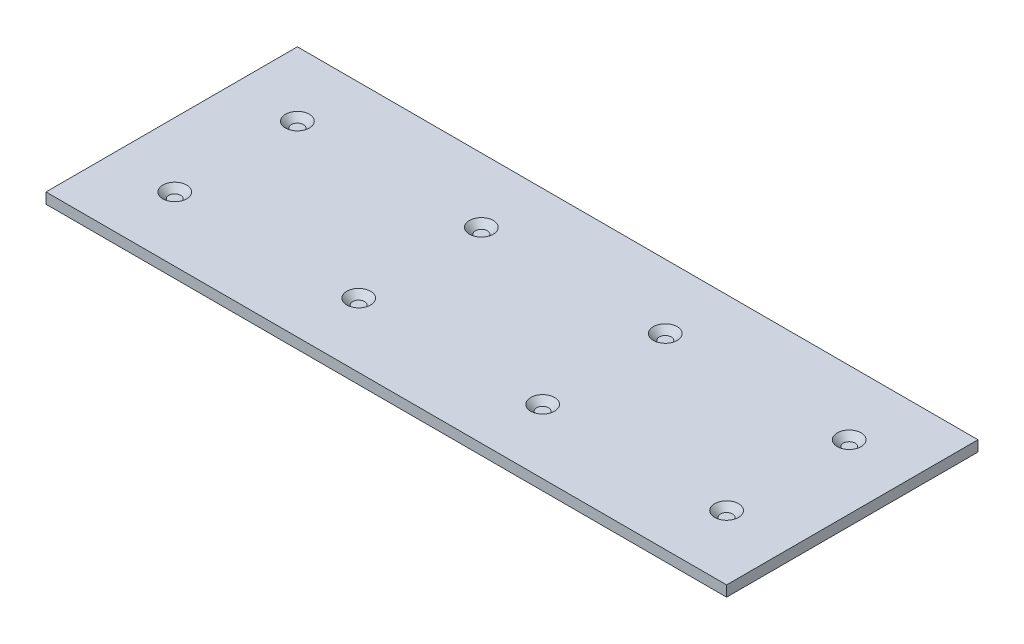
ISO-10303-21;
HEADER;
FILE_DESCRIPTION(('STEP AP214'),'2;1');
FILE_NAME('part.step','',(''),(''),'','','');
FILE_SCHEMA(('AUTOMOTIVE_DESIGN { 1 0 10303 214 1 1 1 1 }'));
ENDSEC;
DATA;
#1=APPLICATION_CONTEXT('core data for automotive mechanical design processes');
#2=APPLICATION_PROTOCOL_DEFINITION('international standard','automotive_design',2000,#1);
#3=PRODUCT_CONTEXT('',#1,'mechanical');
#4=PRODUCT('Part','Part','',(#3));
#5=PRODUCT_RELATED_PRODUCT_CATEGORY('part','',(#4));
#6=PRODUCT_DEFINITION_FORMATION('','',#4);
#7=PRODUCT_DEFINITION_CONTEXT('part definition',#1,'design');
#8=PRODUCT_DEFINITION('design','',#6,#7);
#9=PRODUCT_DEFINITION_SHAPE('','',#8);
#10=(LENGTH_UNIT() NAMED_UNIT(*) SI_UNIT(.MILLI.,.METRE.));
#11=(NAMED_UNIT(*) PLANE_ANGLE_UNIT() SI_UNIT($,.RADIAN.));
#12=(NAMED_UNIT(*) SI_UNIT($,.STERADIAN.) SOLID_ANGLE_UNIT());
#13=UNCERTAINTY_MEASURE_WITH_UNIT(LENGTH_MEASURE(1.E-05),#10,'distance_accuracy_value','');
#14=(GEOMETRIC_REPRESENTATION_CONTEXT(3) GLOBAL_UNCERTAINTY_ASSIGNED_CONTEXT((#13)) GLOBAL_UNIT_ASSIGNED_CONTEXT((#10,
#11,#12)) REPRESENTATION_CONTEXT('',''));
#15=CARTESIAN_POINT('',(0.,0.,0.));
#16=DIRECTION('',(0.,0.,1.));
#17=DIRECTION('',(1.,0.,0.));
#18=AXIS2_PLACEMENT_3D('',#15,#16,#17);
#19=CARTESIAN_POINT('',(0.,4.,0.));
#20=DIRECTION('',(1.,0.,0.));
#21=DIRECTION('',(0.,0.,-1.));
#22=AXIS2_PLACEMENT_3D('',#19,#20,#21);
#23=PLANE('',#22);
#24=DIRECTION('',(0.,0.,1.));
#25=VECTOR('',#24,1.);
#26=CARTESIAN_POINT('',(0.,0.,0.));
#27=LINE('',#26,#25);
#28=CARTESIAN_POINT('',(0.,0.,-94.3));
#29=VERTEX_POINT('',#28);
#30=CARTESIAN_POINT('',(0.,0.,0.));
#31=VERTEX_POINT('',#30);
#32=EDGE_CURVE('E100',#29,#31,#27,.T.);
#33=ORIENTED_EDGE('',*,*,#32,.T.);
#34=DIRECTION('',(0.,-1.,0.));
#35=VECTOR('',#34,1.);
#36=CARTESIAN_POINT('',(0.,4.,0.));
#37=LINE('',#36,#35);
#38=CARTESIAN_POINT('',(0.,4.,0.));
#39=VERTEX_POINT('',#38);
#40=EDGE_CURVE('E11',#39,#31,#37,.T.);
#41=ORIENTED_EDGE('',*,*,#40,.F.);
#42=DIRECTION('',(0.,0.,1.));
#43=VECTOR('',#42,1.);
#44=CARTESIAN_POINT('',(0.,4.,0.));
#45=LINE('',#44,#43);
#46=CARTESIAN_POINT('',(0.,4.,-94.3));
#47=VERTEX_POINT('',#46);
#48=EDGE_CURVE('E88',#47,#39,#45,.T.);
#49=ORIENTED_EDGE('',*,*,#48,.F.);
#50=DIRECTION('',(0.,-1.,0.));
#51=VECTOR('',#50,1.);
#52=CARTESIAN_POINT('',(0.,4.,-94.3));
#53=LINE('',#52,#51);
#54=EDGE_CURVE('E96',#47,#29,#53,.T.);
#55=ORIENTED_EDGE('',*,*,#54,.T.);
#56=EDGE_LOOP('',(#33,#41,#49,#55));
#57=FACE_BOUND('',#56,.T.);
#58=ADVANCED_FACE('F37',(#57),#23,.F.);
#59=CARTESIAN_POINT('',(0.,4.,0.));
#60=DIRECTION('',(0.,0.,-1.));
#61=DIRECTION('',(-1.,0.,0.));
#62=AXIS2_PLACEMENT_3D('',#59,#60,#61);
#63=PLANE('',#62);
#64=DIRECTION('',(1.,0.,0.));
#65=VECTOR('',#64,1.);
#66=CARTESIAN_POINT('',(0.,0.,0.));
#67=LINE('',#66,#65);
#68=CARTESIAN_POINT('',(255.3,0.,0.));
#69=VERTEX_POINT('',#68);
#70=EDGE_CURVE('E92',#31,#69,#67,.T.);
#71=ORIENTED_EDGE('',*,*,#70,.T.);
#72=DIRECTION('',(0.,-1.,0.));
#73=VECTOR('',#72,1.);
#74=CARTESIAN_POINT('',(255.3,4.,0.));
#75=LINE('',#74,#73);
#76=CARTESIAN_POINT('',(255.3,4.,0.));
#77=VERTEX_POINT('',#76);
#78=EDGE_CURVE('E45',#77,#69,#75,.T.);
#79=ORIENTED_EDGE('',*,*,#78,.F.);
#80=DIRECTION('',(1.,0.,0.));
#81=VECTOR('',#80,1.);
#82=CARTESIAN_POINT('',(0.,4.,0.));
#83=LINE('',#82,#81);
#84=EDGE_CURVE('E83',#39,#77,#83,.T.);
#85=ORIENTED_EDGE('',*,*,#84,.F.);
#86=ORIENTED_EDGE('',*,*,#40,.T.);
#87=EDGE_LOOP('',(#71,#79,#85,#86));
#88=FACE_BOUND('',#87,.T.);
#89=ADVANCED_FACE('F91',(#88),#63,.F.);
#90=CARTESIAN_POINT('',(255.3,4.,0.));
#91=DIRECTION('',(-1.,0.,0.));
#92=DIRECTION('',(0.,0.,1.));
#93=AXIS2_PLACEMENT_3D('',#90,#91,#92);
#94=PLANE('',#93);
#95=DIRECTION('',(0.,0.,-1.));
#96=VECTOR('',#95,1.);
#97=CARTESIAN_POINT('',(255.3,0.,0.));
#98=LINE('',#97,#96);
#99=CARTESIAN_POINT('',(255.3,0.,-94.3));
#100=VERTEX_POINT('',#99);
#101=EDGE_CURVE('E70',#69,#100,#98,.T.);
#102=ORIENTED_EDGE('',*,*,#101,.T.);
#103=DIRECTION('',(0.,-1.,0.));
#104=VECTOR('',#103,1.);
#105=CARTESIAN_POINT('',(255.3,4.,-94.3));
#106=LINE('',#105,#104);
#107=CARTESIAN_POINT('',(255.3,4.,-94.3));
#108=VERTEX_POINT('',#107);
#109=EDGE_CURVE('E93',#108,#100,#106,.T.);
#110=ORIENTED_EDGE('',*,*,#109,.F.);
#111=DIRECTION('',(0.,0.,-1.));
#112=VECTOR('',#111,1.);
#113=CARTESIAN_POINT('',(255.3,4.,0.));
#114=LINE('',#113,#112);
#115=EDGE_CURVE('E86',#77,#108,#114,.T.);
#116=ORIENTED_EDGE('',*,*,#115,.F.);
#117=ORIENTED_EDGE('',*,*,#78,.T.);
#118=EDGE_LOOP('',(#102,#110,#116,#117));
#119=FACE_BOUND('',#118,.T.);
#120=ADVANCED_FACE('F94',(#119),#94,.F.);
#121=CARTESIAN_POINT('',(0.,4.,-94.3));
#122=DIRECTION('',(0.,0.,1.));
#123=DIRECTION('',(1.,0.,0.));
#124=AXIS2_PLACEMENT_3D('',#121,#122,#123);
#125=PLANE('',#124);
#126=DIRECTION('',(-1.,0.,0.));
#127=VECTOR('',#126,1.);
#128=CARTESIAN_POINT('',(0.,0.,-94.3));
#129=LINE('',#128,#127);
#130=EDGE_CURVE('E76',#100,#29,#129,.T.);
#131=ORIENTED_EDGE('',*,*,#130,.T.);
#132=ORIENTED_EDGE('',*,*,#54,.F.);
#133=DIRECTION('',(-1.,0.,0.));
#134=VECTOR('',#133,1.);
#135=CARTESIAN_POINT('',(0.,4.,-94.3));
#136=LINE('',#135,#134);
#137=EDGE_CURVE('E53',#108,#47,#136,.T.);
#138=ORIENTED_EDGE('',*,*,#137,.F.);
#139=ORIENTED_EDGE('',*,*,#109,.T.);
#140=EDGE_LOOP('',(#131,#132,#138,#139));
#141=FACE_BOUND('',#140,.T.);
#142=ADVANCED_FACE('F108',(#141),#125,.F.);
#143=CARTESIAN_POINT('',(0.,4.,0.));
#144=DIRECTION('',(0.,-1.,0.));
#145=DIRECTION('',(0.,0.,-1.));
#146=AXIS2_PLACEMENT_3D('',#143,#144,#145);
#147=PLANE('',#146);
#148=CARTESIAN_POINT('',(24.15,4.,-70.15));
#149=DIRECTION('',(0.,1.,0.));
#150=DIRECTION('',(0.,0.,1.));
#151=AXIS2_PLACEMENT_3D('',#148,#149,#150);
#152=CIRCLE('',#151,4.48);
#153=CARTESIAN_POINT('',(24.15,4.,-65.67));
#154=VERTEX_POINT('',#153);
#155=EDGE_CURVE('E155',#154,#154,#152,.T.);
#156=ORIENTED_EDGE('',*,*,#155,.F.);
#157=EDGE_LOOP('',(#156));
#158=FACE_BOUND('',#157,.T.);
#159=CARTESIAN_POINT('',(24.15,4.,-24.15));
#160=DIRECTION('',(0.,1.,0.));
#161=DIRECTION('',(0.,0.,1.));
#162=AXIS2_PLACEMENT_3D('',#159,#160,#161);
#163=CIRCLE('',#162,4.48);
#164=CARTESIAN_POINT('',(24.15,4.,-19.67));
#165=VERTEX_POINT('',#164);
#166=EDGE_CURVE('E149',#165,#165,#163,.T.);
#167=ORIENTED_EDGE('',*,*,#166,.F.);
#168=EDGE_LOOP('',(#167));
#169=FACE_BOUND('',#168,.T.);
#170=CARTESIAN_POINT('',(93.15,4.,-70.15));
#171=DIRECTION('',(0.,1.,0.));
#172=DIRECTION('',(0.,0.,1.));
#173=AXIS2_PLACEMENT_3D('',#170,#171,#172);
#174=CIRCLE('',#173,4.48);
#175=CARTESIAN_POINT('',(93.15,4.,-65.67));
#176=VERTEX_POINT('',#175);
#177=EDGE_CURVE('E143',#176,#176,#174,.T.);
#178=ORIENTED_EDGE('',*,*,#177,.F.);
#179=EDGE_LOOP('',(#178));
#180=FACE_BOUND('',#179,.T.);
#181=CARTESIAN_POINT('',(93.15,4.,-24.15));
#182=DIRECTION('',(0.,1.,0.));
#183=DIRECTION('',(0.,0.,1.));
#184=AXIS2_PLACEMENT_3D('',#181,#182,#183);
#185=CIRCLE('',#184,4.48);
#186=CARTESIAN_POINT('',(93.15,4.,-19.67));
#187=VERTEX_POINT('',#186);
#188=EDGE_CURVE('E137',#187,#187,#185,.T.);
#189=ORIENTED_EDGE('',*,*,#188,.F.);
#190=EDGE_LOOP('',(#189));
#191=FACE_BOUND('',#190,.T.);
#192=CARTESIAN_POINT('',(162.15,4.,-24.15));
#193=DIRECTION('',(0.,1.,0.));
#194=DIRECTION('',(0.,0.,1.));
#195=AXIS2_PLACEMENT_3D('',#192,#193,#194);
#196=CIRCLE('',#195,4.48000000000001);
#197=CARTESIAN_POINT('',(162.15,4.,-19.67));
#198=VERTEX_POINT('',#197);
#199=EDGE_CURVE('E131',#198,#198,#196,.T.);
#200=ORIENTED_EDGE('',*,*,#199,.F.);
#201=EDGE_LOOP('',(#200));
#202=FACE_BOUND('',#201,.T.);
#203=CARTESIAN_POINT('',(162.15,4.,-70.15));
#204=DIRECTION('',(0.,1.,0.));
#205=DIRECTION('',(0.,0.,1.));
#206=AXIS2_PLACEMENT_3D('',#203,#204,#205);
#207=CIRCLE('',#206,4.48000000000001);
#208=CARTESIAN_POINT('',(162.15,4.,-65.67));
#209=VERTEX_POINT('',#208);
#210=EDGE_CURVE('E125',#209,#209,#207,.T.);
#211=ORIENTED_EDGE('',*,*,#210,.F.);
#212=EDGE_LOOP('',(#211));
#213=FACE_BOUND('',#212,.T.);
#214=CARTESIAN_POINT('',(231.15,4.,-70.15));
#215=DIRECTION('',(0.,1.,0.));
#216=DIRECTION('',(0.,0.,1.));
#217=AXIS2_PLACEMENT_3D('',#214,#215,#216);
#218=CIRCLE('',#217,4.48000000000001);
#219=CARTESIAN_POINT('',(231.15,4.,-65.67));
#220=VERTEX_POINT('',#219);
#221=EDGE_CURVE('E119',#220,#220,#218,.T.);
#222=ORIENTED_EDGE('',*,*,#221,.F.);
#223=EDGE_LOOP('',(#222));
#224=FACE_BOUND('',#223,.T.);
#225=CARTESIAN_POINT('',(231.15,4.,-24.15));
#226=DIRECTION('',(0.,1.,0.));
#227=DIRECTION('',(0.,0.,1.));
#228=AXIS2_PLACEMENT_3D('',#225,#226,#227);
#229=CIRCLE('',#228,4.48000000000001);
#230=CARTESIAN_POINT('',(231.15,4.,-19.67));
#231=VERTEX_POINT('',#230);
#232=EDGE_CURVE('E103',#231,#231,#229,.T.);
#233=ORIENTED_EDGE('',*,*,#232,.F.);
#234=EDGE_LOOP('',(#233));
#235=FACE_BOUND('',#234,.T.);
#236=ORIENTED_EDGE('',*,*,#48,.T.);
#237=ORIENTED_EDGE('',*,*,#84,.T.);
#238=ORIENTED_EDGE('',*,*,#115,.T.);
#239=ORIENTED_EDGE('',*,*,#137,.T.);
#240=EDGE_LOOP('',(#236,#237,#238,#239));
#241=FACE_BOUND('',#240,.T.);
#242=ADVANCED_FACE('F84',(#158,#169,#180,#191,#202,#213,#224,#235,#241),#147,.F.);
#243=CARTESIAN_POINT('',(0.,0.,0.));
#244=DIRECTION('',(0.,-1.,0.));
#245=DIRECTION('',(0.,0.,-1.));
#246=AXIS2_PLACEMENT_3D('',#243,#244,#245);
#247=PLANE('',#246);
#248=ORIENTED_EDGE('',*,*,#32,.F.);
#249=ORIENTED_EDGE('',*,*,#130,.F.);
#250=ORIENTED_EDGE('',*,*,#101,.F.);
#251=ORIENTED_EDGE('',*,*,#70,.F.);
#252=EDGE_LOOP('',(#248,#249,#250,#251));
#253=FACE_BOUND('',#252,.T.);
#254=ADVANCED_FACE('F111',(#253),#247,.T.);
#255=CARTESIAN_POINT('',(231.15,4.,-24.15));
#256=DIRECTION('',(0.,1.,0.));
#257=DIRECTION('',(0.,0.,1.));
#258=AXIS2_PLACEMENT_3D('',#255,#256,#257);
#259=CONICAL_SURFACE('',#258,4.48000000000001,0.78539816339745);
#260=CARTESIAN_POINT('',(231.15,1.77,-24.15));
#261=DIRECTION('',(0.,1.,0.));
#262=DIRECTION('',(0.,0.,1.));
#263=AXIS2_PLACEMENT_3D('',#260,#261,#262);
#264=CIRCLE('',#263,2.25);
#265=CARTESIAN_POINT('',(231.15,1.77,-21.9));
#266=VERTEX_POINT('',#265);
#267=EDGE_CURVE('E116',#266,#266,#264,.T.);
#268=ORIENTED_EDGE('',*,*,#267,.F.);
#269=EDGE_LOOP('',(#268));
#270=FACE_BOUND('',#269,.T.);
#271=ORIENTED_EDGE('',*,*,#232,.T.);
#272=EDGE_LOOP('',(#271));
#273=FACE_BOUND('',#272,.T.);
#274=ADVANCED_FACE('F188',(#270,#273),#259,.F.);
#275=CARTESIAN_POINT('',(233.4,1.77,-24.15));
#276=DIRECTION('',(0.,-1.,0.));
#277=DIRECTION('',(0.,0.,-1.));
#278=AXIS2_PLACEMENT_3D('',#275,#276,#277);
#279=PLANE('',#278);
#280=ORIENTED_EDGE('',*,*,#267,.T.);
#281=EDGE_LOOP('',(#280));
#282=FACE_BOUND('',#281,.T.);
#283=ADVANCED_FACE('F190',(#282),#279,.F.);
#284=CARTESIAN_POINT('',(231.15,4.,-70.15));
#285=DIRECTION('',(0.,1.,0.));
#286=DIRECTION('',(0.,0.,1.));
#287=AXIS2_PLACEMENT_3D('',#284,#285,#286);
#288=CONICAL_SURFACE('',#287,4.48000000000001,0.78539816339745);
#289=CARTESIAN_POINT('',(231.15,1.77,-70.15));
#290=DIRECTION('',(0.,1.,0.));
#291=DIRECTION('',(0.,0.,1.));
#292=AXIS2_PLACEMENT_3D('',#289,#290,#291);
#293=CIRCLE('',#292,2.25);
#294=CARTESIAN_POINT('',(231.15,1.77,-67.9));
#295=VERTEX_POINT('',#294);
#296=EDGE_CURVE('E122',#295,#295,#293,.T.);
#297=ORIENTED_EDGE('',*,*,#296,.F.);
#298=EDGE_LOOP('',(#297));
#299=FACE_BOUND('',#298,.T.);
#300=ORIENTED_EDGE('',*,*,#221,.T.);
#301=EDGE_LOOP('',(#300));
#302=FACE_BOUND('',#301,.T.);
#303=ADVANCED_FACE('F197',(#299,#302),#288,.F.);
#304=CARTESIAN_POINT('',(233.4,1.77,-70.15));
#305=DIRECTION('',(0.,-1.,0.));
#306=DIRECTION('',(0.,0.,-1.));
#307=AXIS2_PLACEMENT_3D('',#304,#305,#306);
#308=PLANE('',#307);
#309=ORIENTED_EDGE('',*,*,#296,.T.);
#310=EDGE_LOOP('',(#309));
#311=FACE_BOUND('',#310,.T.);
#312=ADVANCED_FACE('F247',(#311),#308,.F.);
#313=CARTESIAN_POINT('',(162.15,4.,-70.15));
#314=DIRECTION('',(0.,1.,0.));
#315=DIRECTION('',(0.,0.,1.));
#316=AXIS2_PLACEMENT_3D('',#313,#314,#315);
#317=CONICAL_SURFACE('',#316,4.48000000000001,0.78539816339745);
#318=CARTESIAN_POINT('',(162.15,1.77,-70.15));
#319=DIRECTION('',(0.,1.,0.));
#320=DIRECTION('',(0.,0.,1.));
#321=AXIS2_PLACEMENT_3D('',#318,#319,#320);
#322=CIRCLE('',#321,2.25);
#323=CARTESIAN_POINT('',(162.15,1.77,-67.9));
#324=VERTEX_POINT('',#323);
#325=EDGE_CURVE('E128',#324,#324,#322,.T.);
#326=ORIENTED_EDGE('',*,*,#325,.F.);
#327=EDGE_LOOP('',(#326));
#328=FACE_BOUND('',#327,.T.);
#329=ORIENTED_EDGE('',*,*,#210,.T.);
#330=EDGE_LOOP('',(#329));
#331=FACE_BOUND('',#330,.T.);
#332=ADVANCED_FACE('F257',(#328,#331),#317,.F.);
#333=CARTESIAN_POINT('',(164.4,1.77,-70.15));
#334=DIRECTION('',(0.,-1.,0.));
#335=DIRECTION('',(0.,0.,-1.));
#336=AXIS2_PLACEMENT_3D('',#333,#334,#335);
#337=PLANE('',#336);
#338=ORIENTED_EDGE('',*,*,#325,.T.);
#339=EDGE_LOOP('',(#338));
#340=FACE_BOUND('',#339,.T.);
#341=ADVANCED_FACE('F267',(#340),#337,.F.);
#342=CARTESIAN_POINT('',(162.15,4.,-24.15));
#343=DIRECTION('',(0.,1.,0.));
#344=DIRECTION('',(0.,0.,1.));
#345=AXIS2_PLACEMENT_3D('',#342,#343,#344);
#346=CONICAL_SURFACE('',#345,4.48000000000001,0.78539816339745);
#347=CARTESIAN_POINT('',(162.15,1.77,-24.15));
#348=DIRECTION('',(0.,1.,0.));
#349=DIRECTION('',(0.,0.,1.));
#350=AXIS2_PLACEMENT_3D('',#347,#348,#349);
#351=CIRCLE('',#350,2.25);
#352=CARTESIAN_POINT('',(162.15,1.77,-21.9));
#353=VERTEX_POINT('',#352);
#354=EDGE_CURVE('E134',#353,#353,#351,.T.);
#355=ORIENTED_EDGE('',*,*,#354,.F.);
#356=EDGE_LOOP('',(#355));
#357=FACE_BOUND('',#356,.T.);
#358=ORIENTED_EDGE('',*,*,#199,.T.);
#359=EDGE_LOOP('',(#358));
#360=FACE_BOUND('',#359,.T.);
#361=ADVANCED_FACE('F277',(#357,#360),#346,.F.);
#362=CARTESIAN_POINT('',(164.4,1.77,-24.15));
#363=DIRECTION('',(0.,-1.,0.));
#364=DIRECTION('',(0.,0.,-1.));
#365=AXIS2_PLACEMENT_3D('',#362,#363,#364);
#366=PLANE('',#365);
#367=ORIENTED_EDGE('',*,*,#354,.T.);
#368=EDGE_LOOP('',(#367));
#369=FACE_BOUND('',#368,.T.);
#370=ADVANCED_FACE('F287',(#369),#366,.F.);
#371=CARTESIAN_POINT('',(93.15,4.,-24.15));
#372=DIRECTION('',(0.,1.,0.));
#373=DIRECTION('',(0.,0.,1.));
#374=AXIS2_PLACEMENT_3D('',#371,#372,#373);
#375=CONICAL_SURFACE('',#374,4.48,0.785398163397447);
#376=CARTESIAN_POINT('',(93.15,1.77,-24.15));
#377=DIRECTION('',(0.,1.,0.));
#378=DIRECTION('',(0.,0.,1.));
#379=AXIS2_PLACEMENT_3D('',#376,#377,#378);
#380=CIRCLE('',#379,2.25);
#381=CARTESIAN_POINT('',(93.15,1.77,-21.9));
#382=VERTEX_POINT('',#381);
#383=EDGE_CURVE('E140',#382,#382,#380,.T.);
#384=ORIENTED_EDGE('',*,*,#383,.F.);
#385=EDGE_LOOP('',(#384));
#386=FACE_BOUND('',#385,.T.);
#387=ORIENTED_EDGE('',*,*,#188,.T.);
#388=EDGE_LOOP('',(#387));
#389=FACE_BOUND('',#388,.T.);
#390=ADVANCED_FACE('F297',(#386,#389),#375,.F.);
#391=CARTESIAN_POINT('',(95.4,1.77,-24.15));
#392=DIRECTION('',(0.,-1.,0.));
#393=DIRECTION('',(0.,0.,-1.));
#394=AXIS2_PLACEMENT_3D('',#391,#392,#393);
#395=PLANE('',#394);
#396=ORIENTED_EDGE('',*,*,#383,.T.);
#397=EDGE_LOOP('',(#396));
#398=FACE_BOUND('',#397,.T.);
#399=ADVANCED_FACE('F307',(#398),#395,.F.);
#400=CARTESIAN_POINT('',(93.15,4.,-70.15));
#401=DIRECTION('',(0.,1.,0.));
#402=DIRECTION('',(0.,0.,1.));
#403=AXIS2_PLACEMENT_3D('',#400,#401,#402);
#404=CONICAL_SURFACE('',#403,4.48,0.785398163397447);
#405=CARTESIAN_POINT('',(93.15,1.77,-70.15));
#406=DIRECTION('',(0.,1.,0.));
#407=DIRECTION('',(0.,0.,1.));
#408=AXIS2_PLACEMENT_3D('',#405,#406,#407);
#409=CIRCLE('',#408,2.25);
#410=CARTESIAN_POINT('',(93.15,1.77,-67.9));
#411=VERTEX_POINT('',#410);
#412=EDGE_CURVE('E146',#411,#411,#409,.T.);
#413=ORIENTED_EDGE('',*,*,#412,.F.);
#414=EDGE_LOOP('',(#413));
#415=FACE_BOUND('',#414,.T.);
#416=ORIENTED_EDGE('',*,*,#177,.T.);
#417=EDGE_LOOP('',(#416));
#418=FACE_BOUND('',#417,.T.);
#419=ADVANCED_FACE('F317',(#415,#418),#404,.F.);
#420=CARTESIAN_POINT('',(95.4,1.77,-70.15));
#421=DIRECTION('',(0.,-1.,0.));
#422=DIRECTION('',(0.,0.,-1.));
#423=AXIS2_PLACEMENT_3D('',#420,#421,#422);
#424=PLANE('',#423);
#425=ORIENTED_EDGE('',*,*,#412,.T.);
#426=EDGE_LOOP('',(#425));
#427=FACE_BOUND('',#426,.T.);
#428=ADVANCED_FACE('F327',(#427),#424,.F.);
#429=CARTESIAN_POINT('',(24.15,4.,-24.15));
#430=DIRECTION('',(0.,1.,0.));
#431=DIRECTION('',(0.,0.,1.));
#432=AXIS2_PLACEMENT_3D('',#429,#430,#431);
#433=CONICAL_SURFACE('',#432,4.48,0.785398163397449);
#434=CARTESIAN_POINT('',(24.15,1.77,-24.15));
#435=DIRECTION('',(0.,1.,0.));
#436=DIRECTION('',(0.,0.,1.));
#437=AXIS2_PLACEMENT_3D('',#434,#435,#436);
#438=CIRCLE('',#437,2.25);
#439=CARTESIAN_POINT('',(24.15,1.77,-21.9));
#440=VERTEX_POINT('',#439);
#441=EDGE_CURVE('E152',#440,#440,#438,.T.);
#442=ORIENTED_EDGE('',*,*,#441,.F.);
#443=EDGE_LOOP('',(#442));
#444=FACE_BOUND('',#443,.T.);
#445=ORIENTED_EDGE('',*,*,#166,.T.);
#446=EDGE_LOOP('',(#445));
#447=FACE_BOUND('',#446,.T.);
#448=ADVANCED_FACE('F337',(#444,#447),#433,.F.);
#449=CARTESIAN_POINT('',(26.4,1.77,-24.15));
#450=DIRECTION('',(0.,-1.,0.));
#451=DIRECTION('',(0.,0.,-1.));
#452=AXIS2_PLACEMENT_3D('',#449,#450,#451);
#453=PLANE('',#452);
#454=ORIENTED_EDGE('',*,*,#441,.T.);
#455=EDGE_LOOP('',(#454));
#456=FACE_BOUND('',#455,.T.);
#457=ADVANCED_FACE('F167',(#456),#453,.F.);
#458=CARTESIAN_POINT('',(24.15,4.,-70.15));
#459=DIRECTION('',(0.,1.,0.));
#460=DIRECTION('',(0.,0.,1.));
#461=AXIS2_PLACEMENT_3D('',#458,#459,#460);
#462=CONICAL_SURFACE('',#461,4.48,0.785398163397449);
#463=CARTESIAN_POINT('',(24.15,1.77,-70.15));
#464=DIRECTION('',(0.,1.,0.));
#465=DIRECTION('',(0.,0.,1.));
#466=AXIS2_PLACEMENT_3D('',#463,#464,#465);
#467=CIRCLE('',#466,2.25);
#468=CARTESIAN_POINT('',(24.15,1.77,-67.9));
#469=VERTEX_POINT('',#468);
#470=EDGE_CURVE('E158',#469,#469,#467,.T.);
#471=ORIENTED_EDGE('',*,*,#470,.F.);
#472=EDGE_LOOP('',(#471));
#473=FACE_BOUND('',#472,.T.);
#474=ORIENTED_EDGE('',*,*,#155,.T.);
#475=EDGE_LOOP('',(#474));
#476=FACE_BOUND('',#475,.T.);
#477=ADVANCED_FACE('F164',(#473,#476),#462,.F.);
#478=CARTESIAN_POINT('',(26.4,1.77,-70.15));
#479=DIRECTION('',(0.,-1.,0.));
#480=DIRECTION('',(0.,0.,-1.));
#481=AXIS2_PLACEMENT_3D('',#478,#479,#480);
#482=PLANE('',#481);
#483=ORIENTED_EDGE('',*,*,#470,.T.);
#484=EDGE_LOOP('',(#483));
#485=FACE_BOUND('',#484,.T.);
#486=ADVANCED_FACE('F162',(#485),#482,.F.);
#487=CLOSED_SHELL('',(#58,#89,#120,#142,#242,#254,#274,#283,#303,#312,#332,#341,#361,#370,#390,
#399,#419,#428,#448,#457,#477,#486));
#488=MANIFOLD_SOLID_BREP('B2',#487);
#489=ADVANCED_BREP_SHAPE_REPRESENTATION('',(#18,#488),#14);
#490=SHAPE_DEFINITION_REPRESENTATION(#9,#489);
ENDSEC;
END-ISO-10303-21;
